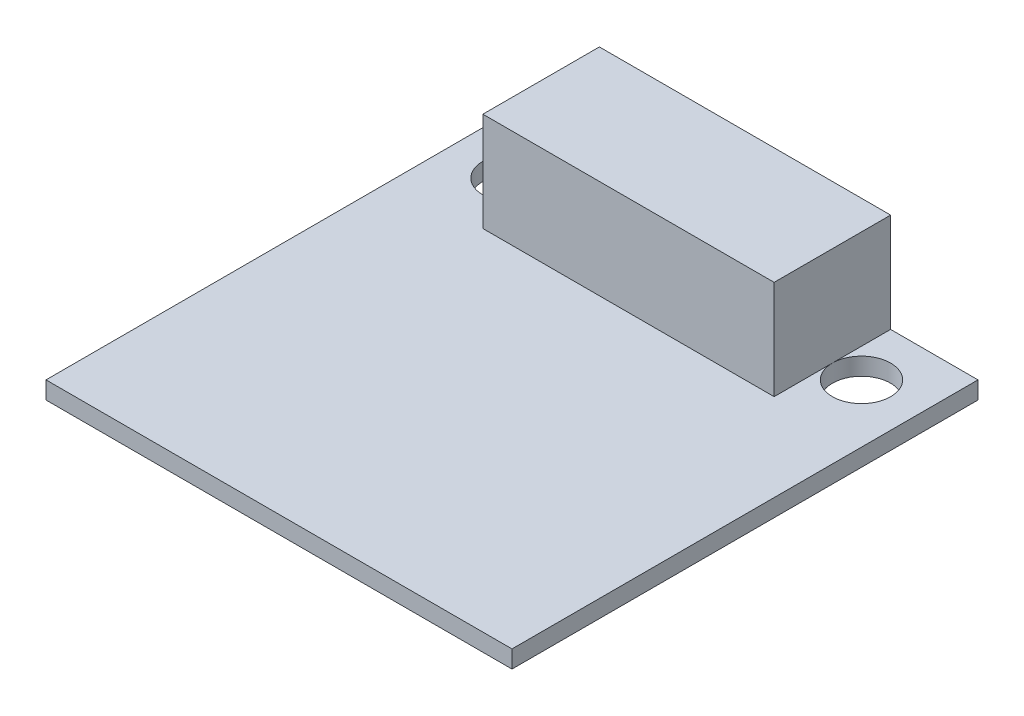
ISO-10303-21;
HEADER;
FILE_DESCRIPTION(('STEP AP214'),'2;1');
FILE_NAME('part.step','',(''),(''),'','','');
FILE_SCHEMA(('AUTOMOTIVE_DESIGN { 1 0 10303 214 1 1 1 1 }'));
ENDSEC;
DATA;
#1=APPLICATION_CONTEXT('core data for automotive mechanical design processes');
#2=APPLICATION_PROTOCOL_DEFINITION('international standard','automotive_design',2000,#1);
#3=PRODUCT_CONTEXT('',#1,'mechanical');
#4=PRODUCT('Part','Part','',(#3));
#5=PRODUCT_RELATED_PRODUCT_CATEGORY('part','',(#4));
#6=PRODUCT_DEFINITION_FORMATION('','',#4);
#7=PRODUCT_DEFINITION_CONTEXT('part definition',#1,'design');
#8=PRODUCT_DEFINITION('design','',#6,#7);
#9=PRODUCT_DEFINITION_SHAPE('','',#8);
#10=(LENGTH_UNIT() NAMED_UNIT(*) SI_UNIT(.MILLI.,.METRE.));
#11=(NAMED_UNIT(*) PLANE_ANGLE_UNIT() SI_UNIT($,.RADIAN.));
#12=(NAMED_UNIT(*) SI_UNIT($,.STERADIAN.) SOLID_ANGLE_UNIT());
#13=UNCERTAINTY_MEASURE_WITH_UNIT(LENGTH_MEASURE(1.E-05),#10,'distance_accuracy_value','');
#14=(GEOMETRIC_REPRESENTATION_CONTEXT(3) GLOBAL_UNCERTAINTY_ASSIGNED_CONTEXT((#13)) GLOBAL_UNIT_ASSIGNED_CONTEXT((#10,
#11,#12)) REPRESENTATION_CONTEXT('',''));
#15=CARTESIAN_POINT('',(0.,0.,0.));
#16=DIRECTION('',(0.,0.,1.));
#17=DIRECTION('',(1.,0.,0.));
#18=AXIS2_PLACEMENT_3D('',#15,#16,#17);
#19=CARTESIAN_POINT('',(0.,5.93226435177457,-12.4906807845755));
#20=DIRECTION('',(0.,1.,0.));
#21=DIRECTION('',(0.,0.,1.));
#22=AXIS2_PLACEMENT_3D('',#19,#20,#21);
#23=PLANE('',#22);
#24=DIRECTION('',(1.,0.,0.));
#25=VECTOR('',#24,1.);
#26=CARTESIAN_POINT('',(0.,5.93226435177457,-16.4906807845755));
#27=LINE('',#26,#25);
#28=CARTESIAN_POINT('',(2.5,5.93226435177457,-16.4906807845755));
#29=VERTEX_POINT('',#28);
#30=CARTESIAN_POINT('',(4.,5.93226435177457,-16.4906807845755));
#31=VERTEX_POINT('',#30);
#32=EDGE_CURVE('E167',#29,#31,#27,.T.);
#33=ORIENTED_EDGE('',*,*,#32,.F.);
#34=DIRECTION('',(0.,0.,1.));
#35=VECTOR('',#34,1.);
#36=CARTESIAN_POINT('',(2.5,5.93226435177457,-12.4906807845755));
#37=LINE('',#36,#35);
#38=CARTESIAN_POINT('',(2.5,5.93226435177457,-15.4906807845755));
#39=VERTEX_POINT('',#38);
#40=EDGE_CURVE('E155',#29,#39,#37,.T.);
#41=ORIENTED_EDGE('',*,*,#40,.T.);
#42=CARTESIAN_POINT('',(3.,5.93226435177457,-15.4906807845755));
#43=DIRECTION('',(0.,1.,0.));
#44=DIRECTION('',(0.,0.,1.));
#45=AXIS2_PLACEMENT_3D('',#42,#43,#44);
#46=CIRCLE('',#45,0.5);
#47=EDGE_CURVE('E159',#39,#39,#46,.F.);
#48=ORIENTED_EDGE('',*,*,#47,.T.);
#49=CARTESIAN_POINT('',(2.5,5.93226435177457,-14.4906807845755));
#50=VERTEX_POINT('',#49);
#51=EDGE_CURVE('E60',#39,#50,#37,.T.);
#52=ORIENTED_EDGE('',*,*,#51,.T.);
#53=DIRECTION('',(-1.,0.,0.));
#54=VECTOR('',#53,1.);
#55=CARTESIAN_POINT('',(0.,5.93226435177457,-14.4906807845755));
#56=LINE('',#55,#54);
#57=CARTESIAN_POINT('',(-2.5,5.93226435177457,-14.4906807845755));
#58=VERTEX_POINT('',#57);
#59=EDGE_CURVE('E142',#50,#58,#56,.T.);
#60=ORIENTED_EDGE('',*,*,#59,.T.);
#61=DIRECTION('',(0.,0.,1.));
#62=VECTOR('',#61,1.);
#63=CARTESIAN_POINT('',(-2.5,5.93226435177457,-12.4906807845755));
#64=LINE('',#63,#62);
#65=CARTESIAN_POINT('',(-2.5,5.93226435177457,-15.4906807845755));
#66=VERTEX_POINT('',#65);
#67=EDGE_CURVE('E66',#66,#58,#64,.T.);
#68=ORIENTED_EDGE('',*,*,#67,.F.);
#69=CARTESIAN_POINT('',(-3.,5.93226435177457,-15.4906807845755));
#70=DIRECTION('',(0.,1.,0.));
#71=DIRECTION('',(0.,0.,1.));
#72=AXIS2_PLACEMENT_3D('',#69,#70,#71);
#73=CIRCLE('',#72,0.5);
#74=EDGE_CURVE('E179',#66,#66,#73,.T.);
#75=ORIENTED_EDGE('',*,*,#74,.F.);
#76=CARTESIAN_POINT('',(-2.5,5.93226435177457,-16.4906807845755));
#77=VERTEX_POINT('',#76);
#78=EDGE_CURVE('E147',#77,#66,#64,.T.);
#79=ORIENTED_EDGE('',*,*,#78,.F.);
#80=CARTESIAN_POINT('',(-4.,5.93226435177457,-16.4906807845755));
#81=VERTEX_POINT('',#80);
#82=EDGE_CURVE('E168',#81,#77,#27,.T.);
#83=ORIENTED_EDGE('',*,*,#82,.F.);
#84=DIRECTION('',(0.,0.,-1.));
#85=VECTOR('',#84,1.);
#86=CARTESIAN_POINT('',(-4.,5.93226435177457,-12.4906807845755));
#87=LINE('',#86,#85);
#88=CARTESIAN_POINT('',(-4.,5.93226435177457,-8.49068078457552));
#89=VERTEX_POINT('',#88);
#90=EDGE_CURVE('E172',#89,#81,#87,.T.);
#91=ORIENTED_EDGE('',*,*,#90,.F.);
#92=DIRECTION('',(1.,0.,0.));
#93=VECTOR('',#92,1.);
#94=CARTESIAN_POINT('',(0.,5.93226435177457,-8.49068078457552));
#95=LINE('',#94,#93);
#96=CARTESIAN_POINT('',(4.,5.93226435177457,-8.49068078457552));
#97=VERTEX_POINT('',#96);
#98=EDGE_CURVE('E176',#89,#97,#95,.T.);
#99=ORIENTED_EDGE('',*,*,#98,.T.);
#100=DIRECTION('',(0.,0.,-1.));
#101=VECTOR('',#100,1.);
#102=CARTESIAN_POINT('',(4.,5.93226435177457,-12.4906807845755));
#103=LINE('',#102,#101);
#104=EDGE_CURVE('E162',#97,#31,#103,.T.);
#105=ORIENTED_EDGE('',*,*,#104,.T.);
#106=EDGE_LOOP('',(#33,#41,#48,#52,#60,#68,#75,#79,#83,#91,#99,#105));
#107=FACE_BOUND('',#106,.T.);
#108=ADVANCED_FACE('F44',(#107),#23,.T.);
#109=CARTESIAN_POINT('',(4.,5.93226435177457,-12.4906807845755));
#110=DIRECTION('',(-1.,0.,0.));
#111=DIRECTION('',(0.,0.,1.));
#112=AXIS2_PLACEMENT_3D('',#109,#110,#111);
#113=PLANE('',#112);
#114=DIRECTION('',(0.,0.,-1.));
#115=VECTOR('',#114,1.);
#116=CARTESIAN_POINT('',(4.,5.63226435177457,-12.4906807845755));
#117=LINE('',#116,#115);
#118=CARTESIAN_POINT('',(4.,5.63226435177457,-8.49068078457552));
#119=VERTEX_POINT('',#118);
#120=CARTESIAN_POINT('',(4.,5.63226435177457,-16.4906807845755));
#121=VERTEX_POINT('',#120);
#122=EDGE_CURVE('E186',#119,#121,#117,.T.);
#123=ORIENTED_EDGE('',*,*,#122,.T.);
#124=DIRECTION('',(0.,-1.,0.));
#125=VECTOR('',#124,1.);
#126=CARTESIAN_POINT('',(4.,5.93226435177457,-16.4906807845755));
#127=LINE('',#126,#125);
#128=EDGE_CURVE('E11',#31,#121,#127,.T.);
#129=ORIENTED_EDGE('',*,*,#128,.F.);
#130=ORIENTED_EDGE('',*,*,#104,.F.);
#131=DIRECTION('',(0.,-1.,0.));
#132=VECTOR('',#131,1.);
#133=CARTESIAN_POINT('',(4.,5.93226435177457,-8.49068078457552));
#134=LINE('',#133,#132);
#135=EDGE_CURVE('E182',#97,#119,#134,.T.);
#136=ORIENTED_EDGE('',*,*,#135,.T.);
#137=EDGE_LOOP('',(#123,#129,#130,#136));
#138=FACE_BOUND('',#137,.T.);
#139=ADVANCED_FACE('F228',(#138),#113,.F.);
#140=CARTESIAN_POINT('',(0.,5.93226435177457,-16.4906807845755));
#141=DIRECTION('',(0.,0.,-1.));
#142=DIRECTION('',(-1.,0.,0.));
#143=AXIS2_PLACEMENT_3D('',#140,#141,#142);
#144=PLANE('',#143);
#145=ORIENTED_EDGE('',*,*,#82,.T.);
#146=DIRECTION('',(0.,-1.,0.));
#147=VECTOR('',#146,1.);
#148=CARTESIAN_POINT('',(-2.5,7.63226435177457,-16.4906807845755));
#149=LINE('',#148,#147);
#150=CARTESIAN_POINT('',(-2.5,7.63226435177457,-16.4906807845755));
#151=VERTEX_POINT('',#150);
#152=EDGE_CURVE('E149',#151,#77,#149,.T.);
#153=ORIENTED_EDGE('',*,*,#152,.F.);
#154=DIRECTION('',(1.,0.,0.));
#155=VECTOR('',#154,1.);
#156=CARTESIAN_POINT('',(0.,7.63226435177457,-16.4906807845755));
#157=LINE('',#156,#155);
#158=CARTESIAN_POINT('',(2.5,7.63226435177457,-16.4906807845755));
#159=VERTEX_POINT('',#158);
#160=EDGE_CURVE('E129',#151,#159,#157,.T.);
#161=ORIENTED_EDGE('',*,*,#160,.T.);
#162=DIRECTION('',(0.,-1.,0.));
#163=VECTOR('',#162,1.);
#164=CARTESIAN_POINT('',(2.5,7.63226435177457,-16.4906807845755));
#165=LINE('',#164,#163);
#166=EDGE_CURVE('E124',#159,#29,#165,.T.);
#167=ORIENTED_EDGE('',*,*,#166,.T.);
#168=ORIENTED_EDGE('',*,*,#32,.T.);
#169=ORIENTED_EDGE('',*,*,#128,.T.);
#170=DIRECTION('',(1.,0.,0.));
#171=VECTOR('',#170,1.);
#172=CARTESIAN_POINT('',(0.,5.63226435177457,-16.4906807845755));
#173=LINE('',#172,#171);
#174=CARTESIAN_POINT('',(-4.,5.63226435177457,-16.4906807845755));
#175=VERTEX_POINT('',#174);
#176=EDGE_CURVE('E190',#175,#121,#173,.T.);
#177=ORIENTED_EDGE('',*,*,#176,.F.);
#178=DIRECTION('',(0.,-1.,0.));
#179=VECTOR('',#178,1.);
#180=CARTESIAN_POINT('',(-4.,5.93226435177457,-16.4906807845755));
#181=LINE('',#180,#179);
#182=EDGE_CURVE('E53',#81,#175,#181,.T.);
#183=ORIENTED_EDGE('',*,*,#182,.F.);
#184=EDGE_LOOP('',(#145,#153,#161,#167,#168,#169,#177,#183));
#185=FACE_BOUND('',#184,.T.);
#186=ADVANCED_FACE('F216',(#185),#144,.T.);
#187=CARTESIAN_POINT('',(-4.,5.93226435177457,-12.4906807845755));
#188=DIRECTION('',(-1.,0.,0.));
#189=DIRECTION('',(0.,0.,1.));
#190=AXIS2_PLACEMENT_3D('',#187,#188,#189);
#191=PLANE('',#190);
#192=DIRECTION('',(0.,0.,-1.));
#193=VECTOR('',#192,1.);
#194=CARTESIAN_POINT('',(-4.,5.63226435177457,-12.4906807845755));
#195=LINE('',#194,#193);
#196=CARTESIAN_POINT('',(-4.,5.63226435177457,-8.49068078457552));
#197=VERTEX_POINT('',#196);
#198=EDGE_CURVE('E193',#197,#175,#195,.T.);
#199=ORIENTED_EDGE('',*,*,#198,.F.);
#200=DIRECTION('',(0.,-1.,0.));
#201=VECTOR('',#200,1.);
#202=CARTESIAN_POINT('',(-4.,5.93226435177457,-8.49068078457552));
#203=LINE('',#202,#201);
#204=EDGE_CURVE('E206',#89,#197,#203,.T.);
#205=ORIENTED_EDGE('',*,*,#204,.F.);
#206=ORIENTED_EDGE('',*,*,#90,.T.);
#207=ORIENTED_EDGE('',*,*,#182,.T.);
#208=EDGE_LOOP('',(#199,#205,#206,#207));
#209=FACE_BOUND('',#208,.T.);
#210=ADVANCED_FACE('F212',(#209),#191,.T.);
#211=CARTESIAN_POINT('',(0.,5.93226435177457,-8.49068078457552));
#212=DIRECTION('',(0.,0.,-1.));
#213=DIRECTION('',(-1.,0.,0.));
#214=AXIS2_PLACEMENT_3D('',#211,#212,#213);
#215=PLANE('',#214);
#216=DIRECTION('',(1.,0.,0.));
#217=VECTOR('',#216,1.);
#218=CARTESIAN_POINT('',(0.,5.63226435177457,-8.49068078457552));
#219=LINE('',#218,#217);
#220=EDGE_CURVE('E197',#197,#119,#219,.T.);
#221=ORIENTED_EDGE('',*,*,#220,.T.);
#222=ORIENTED_EDGE('',*,*,#135,.F.);
#223=ORIENTED_EDGE('',*,*,#98,.F.);
#224=ORIENTED_EDGE('',*,*,#204,.T.);
#225=EDGE_LOOP('',(#221,#222,#223,#224));
#226=FACE_BOUND('',#225,.T.);
#227=ADVANCED_FACE('F224',(#226),#215,.F.);
#228=CARTESIAN_POINT('',(3.,5.93226435177457,-15.4906807845755));
#229=DIRECTION('',(0.,-1.,0.));
#230=DIRECTION('',(0.,0.,-1.));
#231=AXIS2_PLACEMENT_3D('',#228,#229,#230);
#232=CYLINDRICAL_SURFACE('',#231,0.5);
#233=ORIENTED_EDGE('',*,*,#47,.F.);
#234=EDGE_LOOP('',(#233));
#235=FACE_BOUND('',#234,.T.);
#236=CARTESIAN_POINT('',(3.,5.63226435177457,-15.4906807845755));
#237=DIRECTION('',(0.,1.,0.));
#238=DIRECTION('',(0.,0.,1.));
#239=AXIS2_PLACEMENT_3D('',#236,#237,#238);
#240=CIRCLE('',#239,0.5);
#241=CARTESIAN_POINT('',(3.,5.63226435177457,-14.9906807845755));
#242=VERTEX_POINT('',#241);
#243=EDGE_CURVE('E158',#242,#242,#240,.F.);
#244=ORIENTED_EDGE('',*,*,#243,.T.);
#245=EDGE_LOOP('',(#244));
#246=FACE_BOUND('',#245,.T.);
#247=ADVANCED_FACE('F46',(#235,#246),#232,.F.);
#248=CARTESIAN_POINT('',(-3.,5.93226435177457,-15.4906807845755));
#249=DIRECTION('',(0.,-1.,0.));
#250=DIRECTION('',(0.,0.,-1.));
#251=AXIS2_PLACEMENT_3D('',#248,#249,#250);
#252=CYLINDRICAL_SURFACE('',#251,0.5);
#253=CARTESIAN_POINT('',(-3.,5.63226435177457,-15.4906807845755));
#254=DIRECTION('',(0.,1.,0.));
#255=DIRECTION('',(0.,0.,1.));
#256=AXIS2_PLACEMENT_3D('',#253,#254,#255);
#257=CIRCLE('',#256,0.5);
#258=CARTESIAN_POINT('',(-3.,5.63226435177457,-14.9906807845755));
#259=VERTEX_POINT('',#258);
#260=EDGE_CURVE('E163',#259,#259,#257,.T.);
#261=ORIENTED_EDGE('',*,*,#260,.F.);
#262=EDGE_LOOP('',(#261));
#263=FACE_BOUND('',#262,.T.);
#264=ORIENTED_EDGE('',*,*,#74,.T.);
#265=EDGE_LOOP('',(#264));
#266=FACE_BOUND('',#265,.T.);
#267=ADVANCED_FACE('F248',(#263,#266),#252,.F.);
#268=CARTESIAN_POINT('',(0.,5.63226435177457,-12.4906807845755));
#269=DIRECTION('',(0.,1.,0.));
#270=DIRECTION('',(0.,0.,1.));
#271=AXIS2_PLACEMENT_3D('',#268,#269,#270);
#272=PLANE('',#271);
#273=ORIENTED_EDGE('',*,*,#243,.F.);
#274=EDGE_LOOP('',(#273));
#275=FACE_BOUND('',#274,.T.);
#276=ORIENTED_EDGE('',*,*,#260,.T.);
#277=EDGE_LOOP('',(#276));
#278=FACE_BOUND('',#277,.T.);
#279=ORIENTED_EDGE('',*,*,#176,.T.);
#280=ORIENTED_EDGE('',*,*,#122,.F.);
#281=ORIENTED_EDGE('',*,*,#220,.F.);
#282=ORIENTED_EDGE('',*,*,#198,.T.);
#283=EDGE_LOOP('',(#279,#280,#281,#282));
#284=FACE_BOUND('',#283,.T.);
#285=ADVANCED_FACE('F221',(#275,#278,#284),#272,.F.);
#286=CARTESIAN_POINT('',(0.,7.63226435177457,-14.4906807845755));
#287=DIRECTION('',(0.,0.,-1.));
#288=DIRECTION('',(-1.,0.,0.));
#289=AXIS2_PLACEMENT_3D('',#286,#287,#288);
#290=PLANE('',#289);
#291=ORIENTED_EDGE('',*,*,#59,.F.);
#292=DIRECTION('',(0.,-1.,0.));
#293=VECTOR('',#292,1.);
#294=CARTESIAN_POINT('',(2.5,7.63226435177457,-14.4906807845755));
#295=LINE('',#294,#293);
#296=CARTESIAN_POINT('',(2.5,7.63226435177457,-14.4906807845755));
#297=VERTEX_POINT('',#296);
#298=EDGE_CURVE('E122',#297,#50,#295,.T.);
#299=ORIENTED_EDGE('',*,*,#298,.F.);
#300=DIRECTION('',(1.,0.,0.));
#301=VECTOR('',#300,1.);
#302=CARTESIAN_POINT('',(0.,7.63226435177457,-14.4906807845755));
#303=LINE('',#302,#301);
#304=CARTESIAN_POINT('',(-2.5,7.63226435177457,-14.4906807845755));
#305=VERTEX_POINT('',#304);
#306=EDGE_CURVE('E130',#305,#297,#303,.T.);
#307=ORIENTED_EDGE('',*,*,#306,.F.);
#308=DIRECTION('',(0.,-1.,0.));
#309=VECTOR('',#308,1.);
#310=CARTESIAN_POINT('',(-2.5,7.63226435177457,-14.4906807845755));
#311=LINE('',#310,#309);
#312=EDGE_CURVE('E234',#305,#58,#311,.T.);
#313=ORIENTED_EDGE('',*,*,#312,.T.);
#314=EDGE_LOOP('',(#291,#299,#307,#313));
#315=FACE_BOUND('',#314,.T.);
#316=ADVANCED_FACE('F141',(#315),#290,.F.);
#317=CARTESIAN_POINT('',(2.5,7.63226435177457,-12.4906807845755));
#318=DIRECTION('',(-1.,0.,0.));
#319=DIRECTION('',(0.,0.,1.));
#320=AXIS2_PLACEMENT_3D('',#317,#318,#319);
#321=PLANE('',#320);
#322=ORIENTED_EDGE('',*,*,#40,.F.);
#323=ORIENTED_EDGE('',*,*,#166,.F.);
#324=DIRECTION('',(0.,0.,-1.));
#325=VECTOR('',#324,1.);
#326=CARTESIAN_POINT('',(2.5,7.63226435177457,-12.4906807845755));
#327=LINE('',#326,#325);
#328=EDGE_CURVE('E117',#297,#159,#327,.T.);
#329=ORIENTED_EDGE('',*,*,#328,.F.);
#330=ORIENTED_EDGE('',*,*,#298,.T.);
#331=ORIENTED_EDGE('',*,*,#51,.F.);
#332=EDGE_LOOP('',(#322,#323,#329,#330,#331));
#333=FACE_BOUND('',#332,.T.);
#334=ADVANCED_FACE('F120',(#333),#321,.F.);
#335=CARTESIAN_POINT('',(-2.5,7.63226435177457,-12.4906807845755));
#336=DIRECTION('',(-1.,0.,0.));
#337=DIRECTION('',(0.,0.,1.));
#338=AXIS2_PLACEMENT_3D('',#335,#336,#337);
#339=PLANE('',#338);
#340=ORIENTED_EDGE('',*,*,#152,.T.);
#341=ORIENTED_EDGE('',*,*,#78,.T.);
#342=ORIENTED_EDGE('',*,*,#67,.T.);
#343=ORIENTED_EDGE('',*,*,#312,.F.);
#344=DIRECTION('',(0.,0.,-1.));
#345=VECTOR('',#344,1.);
#346=CARTESIAN_POINT('',(-2.5,7.63226435177457,-12.4906807845755));
#347=LINE('',#346,#345);
#348=EDGE_CURVE('E136',#305,#151,#347,.T.);
#349=ORIENTED_EDGE('',*,*,#348,.T.);
#350=EDGE_LOOP('',(#340,#341,#342,#343,#349));
#351=FACE_BOUND('',#350,.T.);
#352=ADVANCED_FACE('F232',(#351),#339,.T.);
#353=CARTESIAN_POINT('',(0.,7.63226435177457,-12.4906807845755));
#354=DIRECTION('',(0.,1.,0.));
#355=DIRECTION('',(0.,0.,1.));
#356=AXIS2_PLACEMENT_3D('',#353,#354,#355);
#357=PLANE('',#356);
#358=ORIENTED_EDGE('',*,*,#306,.T.);
#359=ORIENTED_EDGE('',*,*,#328,.T.);
#360=ORIENTED_EDGE('',*,*,#160,.F.);
#361=ORIENTED_EDGE('',*,*,#348,.F.);
#362=EDGE_LOOP('',(#358,#359,#360,#361));
#363=FACE_BOUND('',#362,.T.);
#364=ADVANCED_FACE('F134',(#363),#357,.T.);
#365=CLOSED_SHELL('',(#108,#139,#186,#210,#227,#247,#267,#285,#316,#334,#352,#364));
#366=MANIFOLD_SOLID_BREP('B2',#365);
#367=ADVANCED_BREP_SHAPE_REPRESENTATION('',(#18,#366),#14);
#368=SHAPE_DEFINITION_REPRESENTATION(#9,#367);
ENDSEC;
END-ISO-10303-21;
